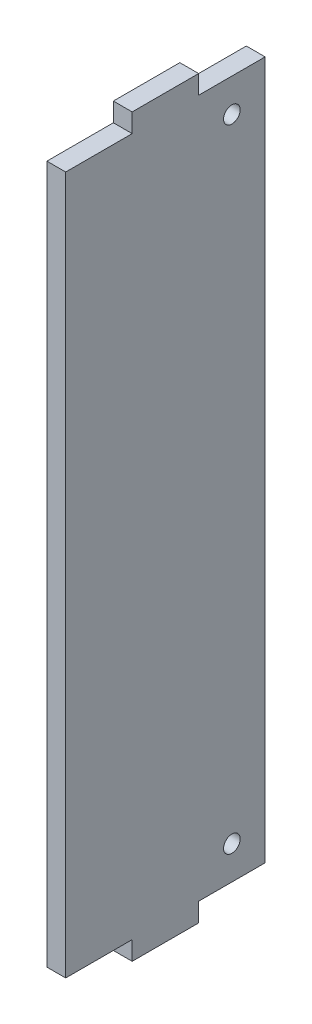
ISO-10303-21;
HEADER;
FILE_DESCRIPTION(('STEP AP214'),'2;1');
FILE_NAME('part.step','',(''),(''),'','','');
FILE_SCHEMA(('AUTOMOTIVE_DESIGN { 1 0 10303 214 1 1 1 1 }'));
ENDSEC;
DATA;
#1=APPLICATION_CONTEXT('core data for automotive mechanical design processes');
#2=APPLICATION_PROTOCOL_DEFINITION('international standard','automotive_design',2000,#1);
#3=PRODUCT_CONTEXT('',#1,'mechanical');
#4=PRODUCT('Part','Part','',(#3));
#5=PRODUCT_RELATED_PRODUCT_CATEGORY('part','',(#4));
#6=PRODUCT_DEFINITION_FORMATION('','',#4);
#7=PRODUCT_DEFINITION_CONTEXT('part definition',#1,'design');
#8=PRODUCT_DEFINITION('design','',#6,#7);
#9=PRODUCT_DEFINITION_SHAPE('','',#8);
#10=(LENGTH_UNIT() NAMED_UNIT(*) SI_UNIT(.MILLI.,.METRE.));
#11=(NAMED_UNIT(*) PLANE_ANGLE_UNIT() SI_UNIT($,.RADIAN.));
#12=(NAMED_UNIT(*) SI_UNIT($,.STERADIAN.) SOLID_ANGLE_UNIT());
#13=UNCERTAINTY_MEASURE_WITH_UNIT(LENGTH_MEASURE(1.E-05),#10,'distance_accuracy_value','');
#14=(GEOMETRIC_REPRESENTATION_CONTEXT(3) GLOBAL_UNCERTAINTY_ASSIGNED_CONTEXT((#13)) GLOBAL_UNIT_ASSIGNED_CONTEXT((#10,
#11,#12)) REPRESENTATION_CONTEXT('',''));
#15=CARTESIAN_POINT('',(0.,0.,0.));
#16=DIRECTION('',(0.,0.,1.));
#17=DIRECTION('',(1.,0.,0.));
#18=AXIS2_PLACEMENT_3D('',#15,#16,#17);
#19=CARTESIAN_POINT('',(74.0812678289975,18.4931544247679,68.8895949971045));
#20=DIRECTION('',(0.,0.,-1.));
#21=DIRECTION('',(-1.,0.,0.));
#22=AXIS2_PLACEMENT_3D('',#19,#20,#21);
#23=PLANE('',#22);
#24=DIRECTION('',(0.,-1.,0.));
#25=VECTOR('',#24,1.);
#26=CARTESIAN_POINT('',(71.2512678289975,18.4931544247679,68.8895949971046));
#27=LINE('',#26,#25);
#28=CARTESIAN_POINT('',(71.2512678289975,18.4931544247679,68.8895949971046));
#29=VERTEX_POINT('',#28);
#30=CARTESIAN_POINT('',(71.2512678289975,15.6631544247679,68.8895949971046));
#31=VERTEX_POINT('',#30);
#32=EDGE_CURVE('E154',#29,#31,#27,.T.);
#33=ORIENTED_EDGE('',*,*,#32,.F.);
#34=DIRECTION('',(-1.,0.,0.));
#35=VECTOR('',#34,1.);
#36=CARTESIAN_POINT('',(74.0812678289975,18.4931544247679,68.8895949971045));
#37=LINE('',#36,#35);
#38=CARTESIAN_POINT('',(74.0812678289975,18.4931544247679,68.8895949971045));
#39=VERTEX_POINT('',#38);
#40=EDGE_CURVE('E11',#39,#29,#37,.T.);
#41=ORIENTED_EDGE('',*,*,#40,.F.);
#42=DIRECTION('',(0.,-1.,0.));
#43=VECTOR('',#42,1.);
#44=CARTESIAN_POINT('',(74.0812678289975,18.4931544247679,68.8895949971045));
#45=LINE('',#44,#43);
#46=CARTESIAN_POINT('',(74.0812678289975,15.6631544247679,68.8895949971045));
#47=VERTEX_POINT('',#46);
#48=EDGE_CURVE('E187',#39,#47,#45,.T.);
#49=ORIENTED_EDGE('',*,*,#48,.T.);
#50=DIRECTION('',(-1.,0.,0.));
#51=VECTOR('',#50,1.);
#52=CARTESIAN_POINT('',(74.0812678289975,15.6631544247679,68.8895949971045));
#53=LINE('',#52,#51);
#54=EDGE_CURVE('E36',#47,#31,#53,.T.);
#55=ORIENTED_EDGE('',*,*,#54,.T.);
#56=EDGE_LOOP('',(#33,#41,#49,#55));
#57=FACE_BOUND('',#56,.T.);
#58=ADVANCED_FACE('F33',(#57),#23,.T.);
#59=CARTESIAN_POINT('',(74.0812678289972,18.4931544247679,58.8895949971045));
#60=DIRECTION('',(0.,-1.,0.));
#61=DIRECTION('',(0.,0.,-1.));
#62=AXIS2_PLACEMENT_3D('',#59,#60,#61);
#63=PLANE('',#62);
#64=DIRECTION('',(0.,0.,1.));
#65=VECTOR('',#64,1.);
#66=CARTESIAN_POINT('',(71.2512678289972,18.4931544247679,58.8895949971046));
#67=LINE('',#66,#65);
#68=CARTESIAN_POINT('',(71.2512678289972,18.4931544247679,58.8895949971046));
#69=VERTEX_POINT('',#68);
#70=EDGE_CURVE('E185',#69,#29,#67,.T.);
#71=ORIENTED_EDGE('',*,*,#70,.F.);
#72=DIRECTION('',(-1.,0.,0.));
#73=VECTOR('',#72,1.);
#74=CARTESIAN_POINT('',(74.0812678289972,18.4931544247679,58.8895949971045));
#75=LINE('',#74,#73);
#76=CARTESIAN_POINT('',(74.0812678289972,18.4931544247679,58.8895949971045));
#77=VERTEX_POINT('',#76);
#78=EDGE_CURVE('E42',#77,#69,#75,.T.);
#79=ORIENTED_EDGE('',*,*,#78,.F.);
#80=DIRECTION('',(0.,0.,1.));
#81=VECTOR('',#80,1.);
#82=CARTESIAN_POINT('',(74.0812678289972,18.4931544247679,58.8895949971045));
#83=LINE('',#82,#81);
#84=EDGE_CURVE('E144',#77,#39,#83,.T.);
#85=ORIENTED_EDGE('',*,*,#84,.T.);
#86=ORIENTED_EDGE('',*,*,#40,.T.);
#87=EDGE_LOOP('',(#71,#79,#85,#86));
#88=FACE_BOUND('',#87,.T.);
#89=ADVANCED_FACE('F207',(#88),#63,.T.);
#90=CARTESIAN_POINT('',(74.0812678289972,123.493154424767,58.8895949971045));
#91=DIRECTION('',(0.,0.,-1.));
#92=DIRECTION('',(-1.,0.,0.));
#93=AXIS2_PLACEMENT_3D('',#90,#91,#92);
#94=PLANE('',#93);
#95=DIRECTION('',(0.,-1.,0.));
#96=VECTOR('',#95,1.);
#97=CARTESIAN_POINT('',(71.2512678289972,123.493154424767,58.8895949971046));
#98=LINE('',#97,#96);
#99=CARTESIAN_POINT('',(71.2512678289972,123.493154424767,58.8895949971046));
#100=VERTEX_POINT('',#99);
#101=EDGE_CURVE('E131',#100,#69,#98,.T.);
#102=ORIENTED_EDGE('',*,*,#101,.F.);
#103=DIRECTION('',(-1.,0.,0.));
#104=VECTOR('',#103,1.);
#105=CARTESIAN_POINT('',(74.0812678289972,123.493154424767,58.8895949971045));
#106=LINE('',#105,#104);
#107=CARTESIAN_POINT('',(74.0812678289972,123.493154424767,58.8895949971045));
#108=VERTEX_POINT('',#107);
#109=EDGE_CURVE('E126',#108,#100,#106,.T.);
#110=ORIENTED_EDGE('',*,*,#109,.F.);
#111=DIRECTION('',(0.,-1.,0.));
#112=VECTOR('',#111,1.);
#113=CARTESIAN_POINT('',(74.0812678289972,123.493154424767,58.8895949971045));
#114=LINE('',#113,#112);
#115=EDGE_CURVE('E129',#108,#77,#114,.T.);
#116=ORIENTED_EDGE('',*,*,#115,.T.);
#117=ORIENTED_EDGE('',*,*,#78,.T.);
#118=EDGE_LOOP('',(#102,#110,#116,#117));
#119=FACE_BOUND('',#118,.T.);
#120=ADVANCED_FACE('F128',(#119),#94,.T.);
#121=CARTESIAN_POINT('',(74.0812678289972,123.493154424767,58.8895949971045));
#122=DIRECTION('',(0.,1.,0.));
#123=DIRECTION('',(0.,0.,1.));
#124=AXIS2_PLACEMENT_3D('',#121,#122,#123);
#125=PLANE('',#124);
#126=DIRECTION('',(0.,0.,-1.));
#127=VECTOR('',#126,1.);
#128=CARTESIAN_POINT('',(71.2512678289972,123.493154424767,58.8895949971046));
#129=LINE('',#128,#127);
#130=CARTESIAN_POINT('',(71.2512678289974,123.493154424767,68.8895949971046));
#131=VERTEX_POINT('',#130);
#132=EDGE_CURVE('E182',#131,#100,#129,.T.);
#133=ORIENTED_EDGE('',*,*,#132,.F.);
#134=DIRECTION('',(-1.,0.,0.));
#135=VECTOR('',#134,1.);
#136=CARTESIAN_POINT('',(74.0812678289974,123.493154424767,68.8895949971045));
#137=LINE('',#136,#135);
#138=CARTESIAN_POINT('',(74.0812678289974,123.493154424767,68.8895949971045));
#139=VERTEX_POINT('',#138);
#140=EDGE_CURVE('E136',#139,#131,#137,.T.);
#141=ORIENTED_EDGE('',*,*,#140,.F.);
#142=DIRECTION('',(0.,0.,-1.));
#143=VECTOR('',#142,1.);
#144=CARTESIAN_POINT('',(74.0812678289972,123.493154424767,58.8895949971045));
#145=LINE('',#144,#143);
#146=EDGE_CURVE('E142',#139,#108,#145,.T.);
#147=ORIENTED_EDGE('',*,*,#146,.T.);
#148=ORIENTED_EDGE('',*,*,#109,.T.);
#149=EDGE_LOOP('',(#133,#141,#147,#148));
#150=FACE_BOUND('',#149,.T.);
#151=ADVANCED_FACE('F146',(#150),#125,.T.);
#152=CARTESIAN_POINT('',(74.0812678289974,126.323154424767,68.8895949971045));
#153=DIRECTION('',(0.,0.,-1.));
#154=DIRECTION('',(-1.,0.,0.));
#155=AXIS2_PLACEMENT_3D('',#152,#153,#154);
#156=PLANE('',#155);
#157=DIRECTION('',(0.,-1.,0.));
#158=VECTOR('',#157,1.);
#159=CARTESIAN_POINT('',(71.2512678289974,126.323154424767,68.8895949971046));
#160=LINE('',#159,#158);
#161=CARTESIAN_POINT('',(71.2512678289974,126.323154424767,68.8895949971046));
#162=VERTEX_POINT('',#161);
#163=EDGE_CURVE('E179',#162,#131,#160,.T.);
#164=ORIENTED_EDGE('',*,*,#163,.F.);
#165=DIRECTION('',(-1.,0.,0.));
#166=VECTOR('',#165,1.);
#167=CARTESIAN_POINT('',(74.0812678289974,126.323154424767,68.8895949971045));
#168=LINE('',#167,#166);
#169=CARTESIAN_POINT('',(74.0812678289974,126.323154424767,68.8895949971045));
#170=VERTEX_POINT('',#169);
#171=EDGE_CURVE('E191',#170,#162,#168,.T.);
#172=ORIENTED_EDGE('',*,*,#171,.F.);
#173=DIRECTION('',(0.,-1.,0.));
#174=VECTOR('',#173,1.);
#175=CARTESIAN_POINT('',(74.0812678289974,126.323154424767,68.8895949971045));
#176=LINE('',#175,#174);
#177=EDGE_CURVE('E147',#170,#139,#176,.T.);
#178=ORIENTED_EDGE('',*,*,#177,.T.);
#179=ORIENTED_EDGE('',*,*,#140,.T.);
#180=EDGE_LOOP('',(#164,#172,#178,#179));
#181=FACE_BOUND('',#180,.T.);
#182=ADVANCED_FACE('F220',(#181),#156,.T.);
#183=CARTESIAN_POINT('',(74.0812678289977,126.323154424767,78.8895949971045));
#184=DIRECTION('',(0.,1.,0.));
#185=DIRECTION('',(-1.,0.,0.));
#186=AXIS2_PLACEMENT_3D('',#183,#184,#185);
#187=PLANE('',#186);
#188=DIRECTION('',(0.,0.,-1.));
#189=VECTOR('',#188,1.);
#190=CARTESIAN_POINT('',(71.2512678289977,126.323154424767,78.8895949971046));
#191=LINE('',#190,#189);
#192=CARTESIAN_POINT('',(71.2512678289977,126.323154424767,78.8895949971046));
#193=VERTEX_POINT('',#192);
#194=EDGE_CURVE('E176',#193,#162,#191,.T.);
#195=ORIENTED_EDGE('',*,*,#194,.F.);
#196=DIRECTION('',(-1.,0.,0.));
#197=VECTOR('',#196,1.);
#198=CARTESIAN_POINT('',(74.0812678289977,126.323154424767,78.8895949971045));
#199=LINE('',#198,#197);
#200=CARTESIAN_POINT('',(74.0812678289977,126.323154424767,78.8895949971045));
#201=VERTEX_POINT('',#200);
#202=EDGE_CURVE('E193',#201,#193,#199,.T.);
#203=ORIENTED_EDGE('',*,*,#202,.F.);
#204=DIRECTION('',(0.,0.,-1.));
#205=VECTOR('',#204,1.);
#206=CARTESIAN_POINT('',(74.0812678289977,126.323154424767,78.8895949971045));
#207=LINE('',#206,#205);
#208=EDGE_CURVE('E149',#201,#170,#207,.T.);
#209=ORIENTED_EDGE('',*,*,#208,.T.);
#210=ORIENTED_EDGE('',*,*,#171,.T.);
#211=EDGE_LOOP('',(#195,#203,#209,#210));
#212=FACE_BOUND('',#211,.T.);
#213=ADVANCED_FACE('F223',(#212),#187,.T.);
#214=CARTESIAN_POINT('',(74.0812678289977,123.493154424767,78.8895949971045));
#215=DIRECTION('',(0.,0.,1.));
#216=DIRECTION('',(1.,0.,0.));
#217=AXIS2_PLACEMENT_3D('',#214,#215,#216);
#218=PLANE('',#217);
#219=DIRECTION('',(0.,1.,0.));
#220=VECTOR('',#219,1.);
#221=CARTESIAN_POINT('',(71.2512678289977,123.493154424767,78.8895949971046));
#222=LINE('',#221,#220);
#223=CARTESIAN_POINT('',(71.2512678289977,123.493154424767,78.8895949971046));
#224=VERTEX_POINT('',#223);
#225=EDGE_CURVE('E173',#224,#193,#222,.T.);
#226=ORIENTED_EDGE('',*,*,#225,.F.);
#227=DIRECTION('',(-1.,0.,0.));
#228=VECTOR('',#227,1.);
#229=CARTESIAN_POINT('',(74.0812678289977,123.493154424767,78.8895949971045));
#230=LINE('',#229,#228);
#231=CARTESIAN_POINT('',(74.0812678289977,123.493154424767,78.8895949971045));
#232=VERTEX_POINT('',#231);
#233=EDGE_CURVE('E195',#232,#224,#230,.T.);
#234=ORIENTED_EDGE('',*,*,#233,.F.);
#235=DIRECTION('',(0.,1.,0.));
#236=VECTOR('',#235,1.);
#237=CARTESIAN_POINT('',(74.0812678289977,123.493154424767,78.8895949971045));
#238=LINE('',#237,#236);
#239=EDGE_CURVE('E294',#232,#201,#238,.T.);
#240=ORIENTED_EDGE('',*,*,#239,.T.);
#241=ORIENTED_EDGE('',*,*,#202,.T.);
#242=EDGE_LOOP('',(#226,#234,#240,#241));
#243=FACE_BOUND('',#242,.T.);
#244=ADVANCED_FACE('F227',(#243),#218,.T.);
#245=CARTESIAN_POINT('',(74.0812678289977,123.493154424767,78.8895949971045));
#246=DIRECTION('',(0.,1.,0.));
#247=DIRECTION('',(0.,0.,1.));
#248=AXIS2_PLACEMENT_3D('',#245,#246,#247);
#249=PLANE('',#248);
#250=DIRECTION('',(0.,0.,-1.));
#251=VECTOR('',#250,1.);
#252=CARTESIAN_POINT('',(71.2512678289977,123.493154424767,78.8895949971046));
#253=LINE('',#252,#251);
#254=CARTESIAN_POINT('',(71.251267828998,123.493154424767,88.8895949971046));
#255=VERTEX_POINT('',#254);
#256=EDGE_CURVE('E170',#255,#224,#253,.T.);
#257=ORIENTED_EDGE('',*,*,#256,.F.);
#258=DIRECTION('',(-1.,0.,0.));
#259=VECTOR('',#258,1.);
#260=CARTESIAN_POINT('',(74.081267828998,123.493154424767,88.8895949971045));
#261=LINE('',#260,#259);
#262=CARTESIAN_POINT('',(74.081267828998,123.493154424767,88.8895949971045));
#263=VERTEX_POINT('',#262);
#264=EDGE_CURVE('E197',#263,#255,#261,.T.);
#265=ORIENTED_EDGE('',*,*,#264,.F.);
#266=DIRECTION('',(0.,0.,-1.));
#267=VECTOR('',#266,1.);
#268=CARTESIAN_POINT('',(74.0812678289977,123.493154424767,78.8895949971045));
#269=LINE('',#268,#267);
#270=EDGE_CURVE('E291',#263,#232,#269,.T.);
#271=ORIENTED_EDGE('',*,*,#270,.T.);
#272=ORIENTED_EDGE('',*,*,#233,.T.);
#273=EDGE_LOOP('',(#257,#265,#271,#272));
#274=FACE_BOUND('',#273,.T.);
#275=ADVANCED_FACE('F231',(#274),#249,.T.);
#276=CARTESIAN_POINT('',(74.081267828998,123.493154424767,88.8895949971045));
#277=DIRECTION('',(0.,0.,1.));
#278=DIRECTION('',(1.,0.,0.));
#279=AXIS2_PLACEMENT_3D('',#276,#277,#278);
#280=PLANE('',#279);
#281=DIRECTION('',(0.,1.,0.));
#282=VECTOR('',#281,1.);
#283=CARTESIAN_POINT('',(71.251267828998,123.493154424767,88.8895949971046));
#284=LINE('',#283,#282);
#285=CARTESIAN_POINT('',(71.251267828998,18.4931544247679,88.8895949971046));
#286=VERTEX_POINT('',#285);
#287=EDGE_CURVE('E167',#286,#255,#284,.T.);
#288=ORIENTED_EDGE('',*,*,#287,.F.);
#289=DIRECTION('',(-1.,0.,0.));
#290=VECTOR('',#289,1.);
#291=CARTESIAN_POINT('',(74.081267828998,18.4931544247679,88.8895949971045));
#292=LINE('',#291,#290);
#293=CARTESIAN_POINT('',(74.081267828998,18.4931544247679,88.8895949971045));
#294=VERTEX_POINT('',#293);
#295=EDGE_CURVE('E199',#294,#286,#292,.T.);
#296=ORIENTED_EDGE('',*,*,#295,.F.);
#297=DIRECTION('',(0.,1.,0.));
#298=VECTOR('',#297,1.);
#299=CARTESIAN_POINT('',(74.081267828998,123.493154424767,88.8895949971045));
#300=LINE('',#299,#298);
#301=EDGE_CURVE('E288',#294,#263,#300,.T.);
#302=ORIENTED_EDGE('',*,*,#301,.T.);
#303=ORIENTED_EDGE('',*,*,#264,.T.);
#304=EDGE_LOOP('',(#288,#296,#302,#303));
#305=FACE_BOUND('',#304,.T.);
#306=ADVANCED_FACE('F235',(#305),#280,.T.);
#307=CARTESIAN_POINT('',(74.0812678289978,18.4931544247679,78.8895949971045));
#308=DIRECTION('',(0.,-1.,0.));
#309=DIRECTION('',(1.,0.,0.));
#310=AXIS2_PLACEMENT_3D('',#307,#308,#309);
#311=PLANE('',#310);
#312=DIRECTION('',(0.,0.,1.));
#313=VECTOR('',#312,1.);
#314=CARTESIAN_POINT('',(71.2512678289978,18.4931544247679,78.8895949971046));
#315=LINE('',#314,#313);
#316=CARTESIAN_POINT('',(71.2512678289978,18.4931544247679,78.8895949971046));
#317=VERTEX_POINT('',#316);
#318=EDGE_CURVE('E164',#317,#286,#315,.T.);
#319=ORIENTED_EDGE('',*,*,#318,.F.);
#320=DIRECTION('',(-1.,0.,0.));
#321=VECTOR('',#320,1.);
#322=CARTESIAN_POINT('',(74.0812678289978,18.4931544247679,78.8895949971045));
#323=LINE('',#322,#321);
#324=CARTESIAN_POINT('',(74.0812678289978,18.4931544247679,78.8895949971045));
#325=VERTEX_POINT('',#324);
#326=EDGE_CURVE('E201',#325,#317,#323,.T.);
#327=ORIENTED_EDGE('',*,*,#326,.F.);
#328=DIRECTION('',(0.,0.,1.));
#329=VECTOR('',#328,1.);
#330=CARTESIAN_POINT('',(74.0812678289978,18.4931544247679,78.8895949971045));
#331=LINE('',#330,#329);
#332=EDGE_CURVE('E285',#325,#294,#331,.T.);
#333=ORIENTED_EDGE('',*,*,#332,.T.);
#334=ORIENTED_EDGE('',*,*,#295,.T.);
#335=EDGE_LOOP('',(#319,#327,#333,#334));
#336=FACE_BOUND('',#335,.T.);
#337=ADVANCED_FACE('F239',(#336),#311,.T.);
#338=CARTESIAN_POINT('',(74.0812678289978,15.6631544247679,78.8895949971045));
#339=DIRECTION('',(0.,0.,1.));
#340=DIRECTION('',(1.,0.,0.));
#341=AXIS2_PLACEMENT_3D('',#338,#339,#340);
#342=PLANE('',#341);
#343=DIRECTION('',(0.,1.,0.));
#344=VECTOR('',#343,1.);
#345=CARTESIAN_POINT('',(71.2512678289978,15.6631544247679,78.8895949971046));
#346=LINE('',#345,#344);
#347=CARTESIAN_POINT('',(71.2512678289978,15.6631544247679,78.8895949971046));
#348=VERTEX_POINT('',#347);
#349=EDGE_CURVE('E161',#348,#317,#346,.T.);
#350=ORIENTED_EDGE('',*,*,#349,.F.);
#351=DIRECTION('',(-1.,0.,0.));
#352=VECTOR('',#351,1.);
#353=CARTESIAN_POINT('',(74.0812678289978,15.6631544247679,78.8895949971045));
#354=LINE('',#353,#352);
#355=CARTESIAN_POINT('',(74.0812678289978,15.6631544247679,78.8895949971045));
#356=VERTEX_POINT('',#355);
#357=EDGE_CURVE('E202',#356,#348,#354,.T.);
#358=ORIENTED_EDGE('',*,*,#357,.F.);
#359=DIRECTION('',(0.,1.,0.));
#360=VECTOR('',#359,1.);
#361=CARTESIAN_POINT('',(74.0812678289978,15.6631544247679,78.8895949971045));
#362=LINE('',#361,#360);
#363=EDGE_CURVE('E282',#356,#325,#362,.T.);
#364=ORIENTED_EDGE('',*,*,#363,.T.);
#365=ORIENTED_EDGE('',*,*,#326,.T.);
#366=EDGE_LOOP('',(#350,#358,#364,#365));
#367=FACE_BOUND('',#366,.T.);
#368=ADVANCED_FACE('F243',(#367),#342,.T.);
#369=CARTESIAN_POINT('',(74.0812678289975,15.6631544247679,68.8895949971045));
#370=DIRECTION('',(0.,-1.,0.));
#371=DIRECTION('',(1.,0.,0.));
#372=AXIS2_PLACEMENT_3D('',#369,#370,#371);
#373=PLANE('',#372);
#374=DIRECTION('',(0.,0.,1.));
#375=VECTOR('',#374,1.);
#376=CARTESIAN_POINT('',(71.2512678289975,15.6631544247679,68.8895949971046));
#377=LINE('',#376,#375);
#378=EDGE_CURVE('E157',#31,#348,#377,.T.);
#379=ORIENTED_EDGE('',*,*,#378,.F.);
#380=ORIENTED_EDGE('',*,*,#54,.F.);
#381=DIRECTION('',(0.,0.,1.));
#382=VECTOR('',#381,1.);
#383=CARTESIAN_POINT('',(74.0812678289975,15.6631544247679,68.8895949971045));
#384=LINE('',#383,#382);
#385=EDGE_CURVE('E280',#47,#356,#384,.T.);
#386=ORIENTED_EDGE('',*,*,#385,.T.);
#387=ORIENTED_EDGE('',*,*,#357,.T.);
#388=EDGE_LOOP('',(#379,#380,#386,#387));
#389=FACE_BOUND('',#388,.T.);
#390=ADVANCED_FACE('F204',(#389),#373,.T.);
#391=CARTESIAN_POINT('',(74.0812678289957,0.,-1.95335981938288E-12));
#392=DIRECTION('',(-1.,0.,0.));
#393=DIRECTION('',(0.,0.,1.));
#394=AXIS2_PLACEMENT_3D('',#391,#392,#393);
#395=PLANE('',#394);
#396=CARTESIAN_POINT('',(74.0812678289974,23.4931544247679,63.8895949971044));
#397=DIRECTION('',(-1.,0.,0.));
#398=DIRECTION('',(0.,0.,1.));
#399=AXIS2_PLACEMENT_3D('',#396,#397,#398);
#400=CIRCLE('',#399,1.25);
#401=CARTESIAN_POINT('',(74.0812678289973,23.4931544247679,62.6395949971044));
#402=VERTEX_POINT('',#401);
#403=EDGE_CURVE('E158',#402,#402,#400,.T.);
#404=ORIENTED_EDGE('',*,*,#403,.T.);
#405=EDGE_LOOP('',(#404));
#406=FACE_BOUND('',#405,.T.);
#407=CARTESIAN_POINT('',(74.0812678289974,118.493154424767,63.8895949971044));
#408=DIRECTION('',(-1.,0.,0.));
#409=DIRECTION('',(0.,0.,1.));
#410=AXIS2_PLACEMENT_3D('',#407,#408,#409);
#411=CIRCLE('',#410,1.25);
#412=CARTESIAN_POINT('',(74.0812678289973,118.493154424767,62.6395949971044));
#413=VERTEX_POINT('',#412);
#414=EDGE_CURVE('E273',#413,#413,#411,.T.);
#415=ORIENTED_EDGE('',*,*,#414,.T.);
#416=EDGE_LOOP('',(#415));
#417=FACE_BOUND('',#416,.T.);
#418=ORIENTED_EDGE('',*,*,#48,.F.);
#419=ORIENTED_EDGE('',*,*,#84,.F.);
#420=ORIENTED_EDGE('',*,*,#115,.F.);
#421=ORIENTED_EDGE('',*,*,#146,.F.);
#422=ORIENTED_EDGE('',*,*,#177,.F.);
#423=ORIENTED_EDGE('',*,*,#208,.F.);
#424=ORIENTED_EDGE('',*,*,#239,.F.);
#425=ORIENTED_EDGE('',*,*,#270,.F.);
#426=ORIENTED_EDGE('',*,*,#301,.F.);
#427=ORIENTED_EDGE('',*,*,#332,.F.);
#428=ORIENTED_EDGE('',*,*,#363,.F.);
#429=ORIENTED_EDGE('',*,*,#385,.F.);
#430=EDGE_LOOP('',(#418,#419,#420,#421,#422,#423,#424,#425,#426,#427,#428,#429));
#431=FACE_BOUND('',#430,.T.);
#432=ADVANCED_FACE('F140',(#406,#417,#431),#395,.F.);
#433=CARTESIAN_POINT('',(71.2512678289957,0.,-1.87873895434026E-12));
#434=DIRECTION('',(-1.,0.,0.));
#435=DIRECTION('',(0.,0.,1.));
#436=AXIS2_PLACEMENT_3D('',#433,#434,#435);
#437=PLANE('',#436);
#438=CARTESIAN_POINT('',(71.2512678289974,23.4931544247679,63.8895949971044));
#439=DIRECTION('',(-1.,0.,0.));
#440=DIRECTION('',(0.,0.,1.));
#441=AXIS2_PLACEMENT_3D('',#438,#439,#440);
#442=CIRCLE('',#441,1.25);
#443=CARTESIAN_POINT('',(71.2512678289973,23.4931544247679,62.6395949971044));
#444=VERTEX_POINT('',#443);
#445=EDGE_CURVE('E271',#444,#444,#442,.F.);
#446=ORIENTED_EDGE('',*,*,#445,.T.);
#447=EDGE_LOOP('',(#446));
#448=FACE_BOUND('',#447,.T.);
#449=CARTESIAN_POINT('',(71.2512678289974,118.493154424767,63.8895949971044));
#450=DIRECTION('',(-1.,0.,0.));
#451=DIRECTION('',(0.,0.,1.));
#452=AXIS2_PLACEMENT_3D('',#449,#450,#451);
#453=CIRCLE('',#452,1.25);
#454=CARTESIAN_POINT('',(71.2512678289973,118.493154424767,62.6395949971044));
#455=VERTEX_POINT('',#454);
#456=EDGE_CURVE('E309',#455,#455,#453,.F.);
#457=ORIENTED_EDGE('',*,*,#456,.T.);
#458=EDGE_LOOP('',(#457));
#459=FACE_BOUND('',#458,.T.);
#460=ORIENTED_EDGE('',*,*,#32,.T.);
#461=ORIENTED_EDGE('',*,*,#378,.T.);
#462=ORIENTED_EDGE('',*,*,#349,.T.);
#463=ORIENTED_EDGE('',*,*,#318,.T.);
#464=ORIENTED_EDGE('',*,*,#287,.T.);
#465=ORIENTED_EDGE('',*,*,#256,.T.);
#466=ORIENTED_EDGE('',*,*,#225,.T.);
#467=ORIENTED_EDGE('',*,*,#194,.T.);
#468=ORIENTED_EDGE('',*,*,#163,.T.);
#469=ORIENTED_EDGE('',*,*,#132,.T.);
#470=ORIENTED_EDGE('',*,*,#101,.T.);
#471=ORIENTED_EDGE('',*,*,#70,.T.);
#472=EDGE_LOOP('',(#460,#461,#462,#463,#464,#465,#466,#467,#468,#469,#470,#471));
#473=FACE_BOUND('',#472,.T.);
#474=ADVANCED_FACE('F206',(#448,#459,#473),#437,.T.);
#475=CARTESIAN_POINT('',(67.7157339230646,118.493154424767,63.8895949971044));
#476=DIRECTION('',(1.,0.,0.));
#477=DIRECTION('',(0.,0.,-1.));
#478=AXIS2_PLACEMENT_3D('',#475,#476,#477);
#479=CYLINDRICAL_SURFACE('',#478,1.25);
#480=CARTESIAN_POINT('',(71.2512678289973,118.493154424767,62.6395949971044));
#481=CARTESIAN_POINT('',(71.280746995664,118.493154424767,62.6395949971044));
#482=CARTESIAN_POINT('',(71.3102261623307,118.493154424767,62.6395949971044));
#483=CARTESIAN_POINT('',(71.369184495664,118.493154424767,62.6395949971044));
#484=CARTESIAN_POINT('',(71.3986636623307,118.493154424767,62.6395949971044));
#485=CARTESIAN_POINT('',(71.457621995664,118.493154424767,62.6395949971044));
#486=CARTESIAN_POINT('',(71.4871011623307,118.493154424767,62.6395949971044));
#487=CARTESIAN_POINT('',(71.546059495664,118.493154424767,62.6395949971044));
#488=CARTESIAN_POINT('',(71.5755386623307,118.493154424767,62.6395949971044));
#489=CARTESIAN_POINT('',(71.634496995664,118.493154424767,62.6395949971044));
#490=CARTESIAN_POINT('',(71.6639761623307,118.493154424767,62.6395949971044));
#491=CARTESIAN_POINT('',(71.722934495664,118.493154424767,62.6395949971044));
#492=CARTESIAN_POINT('',(71.7524136623307,118.493154424767,62.6395949971044));
#493=CARTESIAN_POINT('',(71.811371995664,118.493154424767,62.6395949971044));
#494=CARTESIAN_POINT('',(71.8408511623307,118.493154424767,62.6395949971044));
#495=CARTESIAN_POINT('',(71.899809495664,118.493154424767,62.6395949971044));
#496=CARTESIAN_POINT('',(71.9292886623307,118.493154424767,62.6395949971044));
#497=CARTESIAN_POINT('',(71.988246995664,118.493154424767,62.6395949971044));
#498=CARTESIAN_POINT('',(72.0177261623307,118.493154424767,62.6395949971044));
#499=CARTESIAN_POINT('',(72.076684495664,118.493154424767,62.6395949971044));
#500=CARTESIAN_POINT('',(72.1061636623307,118.493154424767,62.6395949971044));
#501=CARTESIAN_POINT('',(72.165121995664,118.493154424767,62.6395949971044));
#502=CARTESIAN_POINT('',(72.1946011623307,118.493154424767,62.6395949971044));
#503=CARTESIAN_POINT('',(72.253559495664,118.493154424767,62.6395949971044));
#504=CARTESIAN_POINT('',(72.2830386623307,118.493154424767,62.6395949971044));
#505=CARTESIAN_POINT('',(72.341996995664,118.493154424767,62.6395949971044));
#506=CARTESIAN_POINT('',(72.3714761623307,118.493154424767,62.6395949971044));
#507=CARTESIAN_POINT('',(72.430434495664,118.493154424767,62.6395949971044));
#508=CARTESIAN_POINT('',(72.4599136623307,118.493154424767,62.6395949971044));
#509=CARTESIAN_POINT('',(72.518871995664,118.493154424767,62.6395949971044));
#510=CARTESIAN_POINT('',(72.5483511623307,118.493154424767,62.6395949971044));
#511=CARTESIAN_POINT('',(72.607309495664,118.493154424767,62.6395949971044));
#512=CARTESIAN_POINT('',(72.6367886623307,118.493154424767,62.6395949971044));
#513=CARTESIAN_POINT('',(72.695746995664,118.493154424767,62.6395949971044));
#514=CARTESIAN_POINT('',(72.7252261623307,118.493154424767,62.6395949971044));
#515=CARTESIAN_POINT('',(72.784184495664,118.493154424767,62.6395949971044));
#516=CARTESIAN_POINT('',(72.8136636623307,118.493154424767,62.6395949971044));
#517=CARTESIAN_POINT('',(72.872621995664,118.493154424767,62.6395949971044));
#518=CARTESIAN_POINT('',(72.9021011623307,118.493154424767,62.6395949971044));
#519=CARTESIAN_POINT('',(72.961059495664,118.493154424767,62.6395949971044));
#520=CARTESIAN_POINT('',(72.9905386623307,118.493154424767,62.6395949971044));
#521=CARTESIAN_POINT('',(73.049496995664,118.493154424767,62.6395949971044));
#522=CARTESIAN_POINT('',(73.0789761623307,118.493154424767,62.6395949971044));
#523=CARTESIAN_POINT('',(73.137934495664,118.493154424767,62.6395949971044));
#524=CARTESIAN_POINT('',(73.1674136623307,118.493154424767,62.6395949971044));
#525=CARTESIAN_POINT('',(73.226371995664,118.493154424767,62.6395949971044));
#526=CARTESIAN_POINT('',(73.2558511623307,118.493154424767,62.6395949971044));
#527=CARTESIAN_POINT('',(73.314809495664,118.493154424767,62.6395949971044));
#528=CARTESIAN_POINT('',(73.3442886623307,118.493154424767,62.6395949971044));
#529=CARTESIAN_POINT('',(73.403246995664,118.493154424767,62.6395949971044));
#530=CARTESIAN_POINT('',(73.4327261623307,118.493154424767,62.6395949971044));
#531=CARTESIAN_POINT('',(73.491684495664,118.493154424767,62.6395949971044));
#532=CARTESIAN_POINT('',(73.5211636623307,118.493154424767,62.6395949971044));
#533=CARTESIAN_POINT('',(73.580121995664,118.493154424767,62.6395949971044));
#534=CARTESIAN_POINT('',(73.6096011623307,118.493154424767,62.6395949971044));
#535=CARTESIAN_POINT('',(73.668559495664,118.493154424767,62.6395949971044));
#536=CARTESIAN_POINT('',(73.6980386623307,118.493154424767,62.6395949971044));
#537=CARTESIAN_POINT('',(73.756996995664,118.493154424767,62.6395949971044));
#538=CARTESIAN_POINT('',(73.7864761623307,118.493154424767,62.6395949971044));
#539=CARTESIAN_POINT('',(73.845434495664,118.493154424767,62.6395949971044));
#540=CARTESIAN_POINT('',(73.8749136623307,118.493154424767,62.6395949971044));
#541=CARTESIAN_POINT('',(73.933871995664,118.493154424767,62.6395949971044));
#542=CARTESIAN_POINT('',(73.9633511623307,118.493154424767,62.6395949971044));
#543=CARTESIAN_POINT('',(74.022309495664,118.493154424767,62.6395949971044));
#544=CARTESIAN_POINT('',(74.0517886623307,118.493154424767,62.6395949971044));
#545=CARTESIAN_POINT('',(74.0812678289973,118.493154424767,62.6395949971044));
#546=B_SPLINE_CURVE_WITH_KNOTS('',3,(#480,#481,#482,#483,#484,#485,#486,#487,#488,#489,#490,
#491,#492,#493,#494,#495,#496,#497,#498,#499,#500,#501,#502,#503,#504,#505,#506,#507,#508,#509,
#510,#511,#512,#513,#514,#515,#516,#517,#518,#519,#520,#521,#522,#523,#524,#525,#526,#527,#528,
#529,#530,#531,#532,#533,#534,#535,#536,#537,#538,#539,#540,#541,#542,#543,#544,#545),
.UNSPECIFIED.,.F.,.F.,(4,2,2,2,2,2,2,2,2,2,2,2,2,2,2,2,2,2,2,2,2,2,2,2,2,2,2,2,2,2,2,2,4),(0.,
0.0884374999999965,0.176874999999993,0.26531249999999,0.35375,0.442187499999996,
0.530624999999993,0.619062499999989,0.707499999999986,0.795937499999996,0.884374999999993,
0.972812499999989,1.06125,1.1496875,1.23812499999999,1.32656249999999,1.415,1.5034375,
1.59187499999999,1.68031249999999,1.76875,1.8571875,1.94562499999999,2.03406249999999,2.1225,
2.2109375,2.29937499999999,2.38781249999999,2.47625,2.5646875,2.65312499999999,2.74156249999999,
2.83),.UNSPECIFIED.);
#547=EDGE_CURVE('BSEAM255',#455,#413,#546,.T.);
#548=ORIENTED_EDGE('',*,*,#456,.F.);
#549=ORIENTED_EDGE('',*,*,#414,.F.);
#550=ORIENTED_EDGE('',*,*,#547,.T.);
#551=ORIENTED_EDGE('',*,*,#547,.F.);
#552=EDGE_LOOP('',(#548,#550,#549,#551));
#553=FACE_BOUND('',#552,.T.);
#554=ADVANCED_FACE('F255',(#553),#479,.F.);
#555=CARTESIAN_POINT('',(67.7157339230646,23.4931544247679,63.8895949971044));
#556=DIRECTION('',(1.,0.,0.));
#557=DIRECTION('',(0.,0.,-1.));
#558=AXIS2_PLACEMENT_3D('',#555,#556,#557);
#559=CYLINDRICAL_SURFACE('',#558,1.25);
#560=CARTESIAN_POINT('',(71.2512678289973,23.4931544247679,62.6395949971044));
#561=CARTESIAN_POINT('',(71.280746995664,23.4931544247679,62.6395949971044));
#562=CARTESIAN_POINT('',(71.3102261623307,23.4931544247679,62.6395949971044));
#563=CARTESIAN_POINT('',(71.369184495664,23.4931544247679,62.6395949971044));
#564=CARTESIAN_POINT('',(71.3986636623307,23.4931544247679,62.6395949971044));
#565=CARTESIAN_POINT('',(71.457621995664,23.4931544247679,62.6395949971044));
#566=CARTESIAN_POINT('',(71.4871011623307,23.4931544247679,62.6395949971044));
#567=CARTESIAN_POINT('',(71.546059495664,23.4931544247679,62.6395949971044));
#568=CARTESIAN_POINT('',(71.5755386623307,23.4931544247679,62.6395949971044));
#569=CARTESIAN_POINT('',(71.634496995664,23.4931544247679,62.6395949971044));
#570=CARTESIAN_POINT('',(71.6639761623307,23.4931544247679,62.6395949971044));
#571=CARTESIAN_POINT('',(71.722934495664,23.4931544247679,62.6395949971044));
#572=CARTESIAN_POINT('',(71.7524136623307,23.4931544247679,62.6395949971044));
#573=CARTESIAN_POINT('',(71.811371995664,23.4931544247679,62.6395949971044));
#574=CARTESIAN_POINT('',(71.8408511623307,23.4931544247679,62.6395949971044));
#575=CARTESIAN_POINT('',(71.899809495664,23.4931544247679,62.6395949971044));
#576=CARTESIAN_POINT('',(71.9292886623307,23.4931544247679,62.6395949971044));
#577=CARTESIAN_POINT('',(71.988246995664,23.4931544247679,62.6395949971044));
#578=CARTESIAN_POINT('',(72.0177261623307,23.4931544247679,62.6395949971044));
#579=CARTESIAN_POINT('',(72.076684495664,23.4931544247679,62.6395949971044));
#580=CARTESIAN_POINT('',(72.1061636623307,23.4931544247679,62.6395949971044));
#581=CARTESIAN_POINT('',(72.165121995664,23.4931544247679,62.6395949971044));
#582=CARTESIAN_POINT('',(72.1946011623307,23.4931544247679,62.6395949971044));
#583=CARTESIAN_POINT('',(72.253559495664,23.4931544247679,62.6395949971044));
#584=CARTESIAN_POINT('',(72.2830386623307,23.4931544247679,62.6395949971044));
#585=CARTESIAN_POINT('',(72.341996995664,23.4931544247679,62.6395949971044));
#586=CARTESIAN_POINT('',(72.3714761623307,23.4931544247679,62.6395949971044));
#587=CARTESIAN_POINT('',(72.430434495664,23.4931544247679,62.6395949971044));
#588=CARTESIAN_POINT('',(72.4599136623307,23.4931544247679,62.6395949971044));
#589=CARTESIAN_POINT('',(72.518871995664,23.4931544247679,62.6395949971044));
#590=CARTESIAN_POINT('',(72.5483511623307,23.4931544247679,62.6395949971044));
#591=CARTESIAN_POINT('',(72.607309495664,23.4931544247679,62.6395949971044));
#592=CARTESIAN_POINT('',(72.6367886623307,23.4931544247679,62.6395949971044));
#593=CARTESIAN_POINT('',(72.695746995664,23.4931544247679,62.6395949971044));
#594=CARTESIAN_POINT('',(72.7252261623307,23.4931544247679,62.6395949971044));
#595=CARTESIAN_POINT('',(72.784184495664,23.4931544247679,62.6395949971044));
#596=CARTESIAN_POINT('',(72.8136636623307,23.4931544247679,62.6395949971044));
#597=CARTESIAN_POINT('',(72.872621995664,23.4931544247679,62.6395949971044));
#598=CARTESIAN_POINT('',(72.9021011623307,23.4931544247679,62.6395949971044));
#599=CARTESIAN_POINT('',(72.961059495664,23.4931544247679,62.6395949971044));
#600=CARTESIAN_POINT('',(72.9905386623307,23.4931544247679,62.6395949971044));
#601=CARTESIAN_POINT('',(73.049496995664,23.4931544247679,62.6395949971044));
#602=CARTESIAN_POINT('',(73.0789761623307,23.4931544247679,62.6395949971044));
#603=CARTESIAN_POINT('',(73.137934495664,23.4931544247679,62.6395949971044));
#604=CARTESIAN_POINT('',(73.1674136623307,23.4931544247679,62.6395949971044));
#605=CARTESIAN_POINT('',(73.226371995664,23.4931544247679,62.6395949971044));
#606=CARTESIAN_POINT('',(73.2558511623307,23.4931544247679,62.6395949971044));
#607=CARTESIAN_POINT('',(73.314809495664,23.4931544247679,62.6395949971044));
#608=CARTESIAN_POINT('',(73.3442886623307,23.4931544247679,62.6395949971044));
#609=CARTESIAN_POINT('',(73.403246995664,23.4931544247679,62.6395949971044));
#610=CARTESIAN_POINT('',(73.4327261623307,23.4931544247679,62.6395949971044));
#611=CARTESIAN_POINT('',(73.491684495664,23.4931544247679,62.6395949971044));
#612=CARTESIAN_POINT('',(73.5211636623307,23.4931544247679,62.6395949971044));
#613=CARTESIAN_POINT('',(73.580121995664,23.4931544247679,62.6395949971044));
#614=CARTESIAN_POINT('',(73.6096011623307,23.4931544247679,62.6395949971044));
#615=CARTESIAN_POINT('',(73.668559495664,23.4931544247679,62.6395949971044));
#616=CARTESIAN_POINT('',(73.6980386623307,23.4931544247679,62.6395949971044));
#617=CARTESIAN_POINT('',(73.756996995664,23.4931544247679,62.6395949971044));
#618=CARTESIAN_POINT('',(73.7864761623307,23.4931544247679,62.6395949971044));
#619=CARTESIAN_POINT('',(73.845434495664,23.4931544247679,62.6395949971044));
#620=CARTESIAN_POINT('',(73.8749136623307,23.4931544247679,62.6395949971044));
#621=CARTESIAN_POINT('',(73.933871995664,23.4931544247679,62.6395949971044));
#622=CARTESIAN_POINT('',(73.9633511623307,23.4931544247679,62.6395949971044));
#623=CARTESIAN_POINT('',(74.022309495664,23.4931544247679,62.6395949971044));
#624=CARTESIAN_POINT('',(74.0517886623307,23.4931544247679,62.6395949971044));
#625=CARTESIAN_POINT('',(74.0812678289973,23.4931544247679,62.6395949971044));
#626=B_SPLINE_CURVE_WITH_KNOTS('',3,(#560,#561,#562,#563,#564,#565,#566,#567,#568,#569,#570,
#571,#572,#573,#574,#575,#576,#577,#578,#579,#580,#581,#582,#583,#584,#585,#586,#587,#588,#589,
#590,#591,#592,#593,#594,#595,#596,#597,#598,#599,#600,#601,#602,#603,#604,#605,#606,#607,#608,
#609,#610,#611,#612,#613,#614,#615,#616,#617,#618,#619,#620,#621,#622,#623,#624,#625),
.UNSPECIFIED.,.F.,.F.,(4,2,2,2,2,2,2,2,2,2,2,2,2,2,2,2,2,2,2,2,2,2,2,2,2,2,2,2,2,2,2,2,4),(0.,
0.0884374999999965,0.176874999999993,0.26531249999999,0.35375,0.442187499999996,
0.530624999999993,0.619062499999989,0.707499999999986,0.795937499999996,0.884374999999993,
0.972812499999989,1.06125,1.1496875,1.23812499999999,1.32656249999999,1.415,1.5034375,
1.59187499999999,1.68031249999999,1.76875,1.8571875,1.94562499999999,2.03406249999999,2.1225,
2.2109375,2.29937499999999,2.38781249999999,2.47625,2.5646875,2.65312499999999,2.74156249999999,
2.83),.UNSPECIFIED.);
#627=EDGE_CURVE('BSEAM262',#444,#402,#626,.T.);
#628=ORIENTED_EDGE('',*,*,#445,.F.);
#629=ORIENTED_EDGE('',*,*,#403,.F.);
#630=ORIENTED_EDGE('',*,*,#627,.T.);
#631=ORIENTED_EDGE('',*,*,#627,.F.);
#632=EDGE_LOOP('',(#628,#630,#629,#631));
#633=FACE_BOUND('',#632,.T.);
#634=ADVANCED_FACE('F262',(#633),#559,.F.);
#635=CLOSED_SHELL('',(#58,#89,#120,#151,#182,#213,#244,#275,#306,#337,#368,#390,#432,#474,#554,#634));
#636=MANIFOLD_SOLID_BREP('B2',#635);
#637=ADVANCED_BREP_SHAPE_REPRESENTATION('',(#18,#636),#14);
#638=SHAPE_DEFINITION_REPRESENTATION(#9,#637);
ENDSEC;
END-ISO-10303-21;
